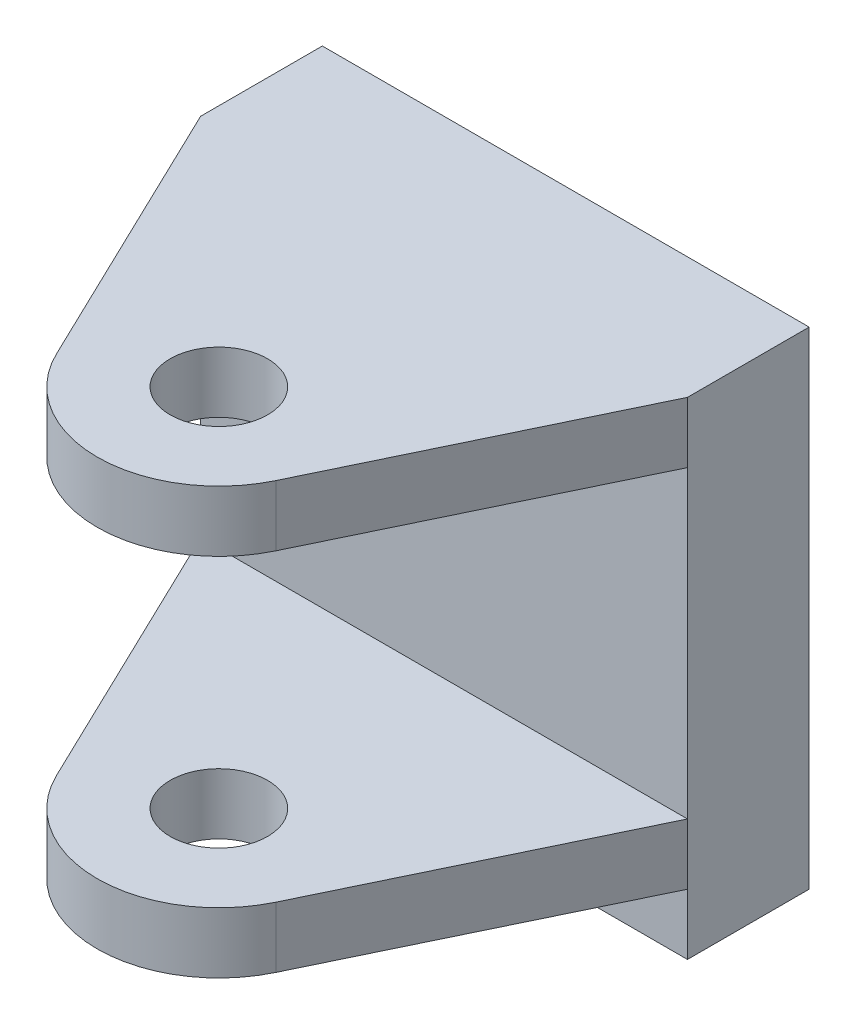
ISO-10303-21;
HEADER;
FILE_DESCRIPTION(('STEP AP214'),'2;1');
FILE_NAME('part.step','',(''),(''),'','','');
FILE_SCHEMA(('AUTOMOTIVE_DESIGN { 1 0 10303 214 1 1 1 1 }'));
ENDSEC;
DATA;
#1=APPLICATION_CONTEXT('core data for automotive mechanical design processes');
#2=APPLICATION_PROTOCOL_DEFINITION('international standard','automotive_design',2000,#1);
#3=PRODUCT_CONTEXT('',#1,'mechanical');
#4=PRODUCT('Part','Part','',(#3));
#5=PRODUCT_RELATED_PRODUCT_CATEGORY('part','',(#4));
#6=PRODUCT_DEFINITION_FORMATION('','',#4);
#7=PRODUCT_DEFINITION_CONTEXT('part definition',#1,'design');
#8=PRODUCT_DEFINITION('design','',#6,#7);
#9=PRODUCT_DEFINITION_SHAPE('','',#8);
#10=(LENGTH_UNIT() NAMED_UNIT(*) SI_UNIT(.MILLI.,.METRE.));
#11=(NAMED_UNIT(*) PLANE_ANGLE_UNIT() SI_UNIT($,.RADIAN.));
#12=(NAMED_UNIT(*) SI_UNIT($,.STERADIAN.) SOLID_ANGLE_UNIT());
#13=UNCERTAINTY_MEASURE_WITH_UNIT(LENGTH_MEASURE(1.E-05),#10,'distance_accuracy_value','');
#14=(GEOMETRIC_REPRESENTATION_CONTEXT(3) GLOBAL_UNCERTAINTY_ASSIGNED_CONTEXT((#13)) GLOBAL_UNIT_ASSIGNED_CONTEXT((#10,
#11,#12)) REPRESENTATION_CONTEXT('',''));
#15=CARTESIAN_POINT('',(0.,0.,0.));
#16=DIRECTION('',(0.,0.,1.));
#17=DIRECTION('',(1.,0.,0.));
#18=AXIS2_PLACEMENT_3D('',#15,#16,#17);
#19=CARTESIAN_POINT('',(0.,0.,10.));
#20=DIRECTION('',(0.,0.,1.));
#21=DIRECTION('',(1.,0.,0.));
#22=AXIS2_PLACEMENT_3D('',#19,#20,#21);
#23=PLANE('',#22);
#24=DIRECTION('',(0.,1.,0.));
#25=VECTOR('',#24,1.);
#26=CARTESIAN_POINT('',(20.,20.,10.));
#27=LINE('',#26,#25);
#28=CARTESIAN_POINT('',(20.,-20.,10.));
#29=VERTEX_POINT('',#28);
#30=CARTESIAN_POINT('',(20.,-15.,10.));
#31=VERTEX_POINT('',#30);
#32=EDGE_CURVE('E183',#29,#31,#27,.T.);
#33=ORIENTED_EDGE('',*,*,#32,.T.);
#34=DIRECTION('',(1.,0.,0.));
#35=VECTOR('',#34,1.);
#36=CARTESIAN_POINT('',(0.,-15.,10.));
#37=LINE('',#36,#35);
#38=CARTESIAN_POINT('',(-20.,-15.,10.));
#39=VERTEX_POINT('',#38);
#40=EDGE_CURVE('E229',#39,#31,#37,.T.);
#41=ORIENTED_EDGE('',*,*,#40,.F.);
#42=DIRECTION('',(0.,-1.,0.));
#43=VECTOR('',#42,1.);
#44=CARTESIAN_POINT('',(-20.,20.,10.));
#45=LINE('',#44,#43);
#46=CARTESIAN_POINT('',(-20.,-20.,10.));
#47=VERTEX_POINT('',#46);
#48=EDGE_CURVE('E186',#39,#47,#45,.T.);
#49=ORIENTED_EDGE('',*,*,#48,.T.);
#50=DIRECTION('',(1.,0.,0.));
#51=VECTOR('',#50,1.);
#52=CARTESIAN_POINT('',(-20.,-20.,10.));
#53=LINE('',#52,#51);
#54=EDGE_CURVE('E191',#47,#29,#53,.T.);
#55=ORIENTED_EDGE('',*,*,#54,.T.);
#56=EDGE_LOOP('',(#33,#41,#49,#55));
#57=FACE_BOUND('',#56,.T.);
#58=ADVANCED_FACE('F37',(#57),#23,.T.);
#59=CARTESIAN_POINT('',(20.,20.,10.));
#60=DIRECTION('',(-1.,0.,0.));
#61=DIRECTION('',(0.,-1.,0.));
#62=AXIS2_PLACEMENT_3D('',#59,#60,#61);
#63=PLANE('',#62);
#64=DIRECTION('',(0.,1.,0.));
#65=VECTOR('',#64,1.);
#66=CARTESIAN_POINT('',(20.,20.,0.));
#67=LINE('',#66,#65);
#68=CARTESIAN_POINT('',(20.,-20.,0.));
#69=VERTEX_POINT('',#68);
#70=CARTESIAN_POINT('',(20.,20.,0.));
#71=VERTEX_POINT('',#70);
#72=EDGE_CURVE('E182',#69,#71,#67,.T.);
#73=ORIENTED_EDGE('',*,*,#72,.T.);
#74=DIRECTION('',(0.,0.,-1.));
#75=VECTOR('',#74,1.);
#76=CARTESIAN_POINT('',(20.,20.,10.));
#77=LINE('',#76,#75);
#78=CARTESIAN_POINT('',(20.,20.,10.));
#79=VERTEX_POINT('',#78);
#80=EDGE_CURVE('E11',#79,#71,#77,.T.);
#81=ORIENTED_EDGE('',*,*,#80,.F.);
#82=DIRECTION('',(0.,-1.,0.));
#83=VECTOR('',#82,1.);
#84=CARTESIAN_POINT('',(20.,20.,10.));
#85=LINE('',#84,#83);
#86=CARTESIAN_POINT('',(20.,15.,10.));
#87=VERTEX_POINT('',#86);
#88=EDGE_CURVE('E165',#79,#87,#85,.T.);
#89=ORIENTED_EDGE('',*,*,#88,.T.);
#90=CARTESIAN_POINT('',(20.,-10.,10.));
#91=VERTEX_POINT('',#90);
#92=EDGE_CURVE('E187',#91,#87,#27,.T.);
#93=ORIENTED_EDGE('',*,*,#92,.F.);
#94=DIRECTION('',(0.,-1.,0.));
#95=VECTOR('',#94,1.);
#96=CARTESIAN_POINT('',(20.,-10.,10.));
#97=LINE('',#96,#95);
#98=EDGE_CURVE('E150',#91,#31,#97,.T.);
#99=ORIENTED_EDGE('',*,*,#98,.T.);
#100=ORIENTED_EDGE('',*,*,#32,.F.);
#101=DIRECTION('',(0.,0.,-1.));
#102=VECTOR('',#101,1.);
#103=CARTESIAN_POINT('',(20.,-20.,10.));
#104=LINE('',#103,#102);
#105=EDGE_CURVE('E194',#29,#69,#104,.T.);
#106=ORIENTED_EDGE('',*,*,#105,.T.);
#107=EDGE_LOOP('',(#73,#81,#89,#93,#99,#100,#106));
#108=FACE_BOUND('',#107,.T.);
#109=ADVANCED_FACE('F39',(#108),#63,.F.);
#110=CARTESIAN_POINT('',(-20.,20.,10.));
#111=DIRECTION('',(0.,-1.,0.));
#112=DIRECTION('',(0.,0.,-1.));
#113=AXIS2_PLACEMENT_3D('',#110,#111,#112);
#114=PLANE('',#113);
#115=DIRECTION('',(-1.,0.,0.));
#116=VECTOR('',#115,1.);
#117=CARTESIAN_POINT('',(-20.,20.,0.));
#118=LINE('',#117,#116);
#119=CARTESIAN_POINT('',(-20.,20.,0.));
#120=VERTEX_POINT('',#119);
#121=EDGE_CURVE('E197',#71,#120,#118,.T.);
#122=ORIENTED_EDGE('',*,*,#121,.T.);
#123=DIRECTION('',(0.,0.,-1.));
#124=VECTOR('',#123,1.);
#125=CARTESIAN_POINT('',(-20.,20.,10.));
#126=LINE('',#125,#124);
#127=CARTESIAN_POINT('',(-20.,20.,10.));
#128=VERTEX_POINT('',#127);
#129=EDGE_CURVE('E45',#128,#120,#126,.T.);
#130=ORIENTED_EDGE('',*,*,#129,.F.);
#131=DIRECTION('',(0.433618101581634,0.,0.901096743963011));
#132=VECTOR('',#131,1.);
#133=CARTESIAN_POINT('',(-20.1468254342011,20.,9.69488376936524));
#134=LINE('',#133,#132);
#135=CARTESIAN_POINT('',(-9.01096743963011,20.,32.8361810158163));
#136=VERTEX_POINT('',#135);
#137=EDGE_CURVE('E154',#128,#136,#134,.T.);
#138=ORIENTED_EDGE('',*,*,#137,.T.);
#139=CARTESIAN_POINT('',(0.,20.,28.5));
#140=DIRECTION('',(0.,1.,0.));
#141=DIRECTION('',(0.,0.,1.));
#142=AXIS2_PLACEMENT_3D('',#139,#140,#141);
#143=CIRCLE('',#142,10.);
#144=CARTESIAN_POINT('',(9.01096743963011,20.,32.8361810158163));
#145=VERTEX_POINT('',#144);
#146=EDGE_CURVE('E157',#136,#145,#143,.T.);
#147=ORIENTED_EDGE('',*,*,#146,.T.);
#148=DIRECTION('',(-0.433618101581633,0.,0.901096743963011));
#149=VECTOR('',#148,1.);
#150=CARTESIAN_POINT('',(20.1468254342011,20.,9.69488376936524));
#151=LINE('',#150,#149);
#152=EDGE_CURVE('E160',#79,#145,#151,.T.);
#153=ORIENTED_EDGE('',*,*,#152,.F.);
#154=ORIENTED_EDGE('',*,*,#80,.T.);
#155=EDGE_LOOP('',(#122,#130,#138,#147,#153,#154));
#156=FACE_BOUND('',#155,.T.);
#157=CARTESIAN_POINT('',(0.,20.,28.5));
#158=DIRECTION('',(0.,1.,0.));
#159=DIRECTION('',(0.,0.,1.));
#160=AXIS2_PLACEMENT_3D('',#157,#158,#159);
#161=CIRCLE('',#160,4.);
#162=CARTESIAN_POINT('',(0.,20.,32.5));
#163=VERTEX_POINT('',#162);
#164=EDGE_CURVE('E163',#163,#163,#161,.T.);
#165=ORIENTED_EDGE('',*,*,#164,.F.);
#166=EDGE_LOOP('',(#165));
#167=FACE_BOUND('',#166,.T.);
#168=ADVANCED_FACE('F245',(#156,#167),#114,.F.);
#169=CARTESIAN_POINT('',(-20.,20.,10.));
#170=DIRECTION('',(1.,0.,0.));
#171=DIRECTION('',(0.,0.,-1.));
#172=AXIS2_PLACEMENT_3D('',#169,#170,#171);
#173=PLANE('',#172);
#174=DIRECTION('',(0.,-1.,0.));
#175=VECTOR('',#174,1.);
#176=CARTESIAN_POINT('',(-20.,20.,0.));
#177=LINE('',#176,#175);
#178=CARTESIAN_POINT('',(-20.,-20.,0.));
#179=VERTEX_POINT('',#178);
#180=EDGE_CURVE('E199',#120,#179,#177,.T.);
#181=ORIENTED_EDGE('',*,*,#180,.T.);
#182=DIRECTION('',(0.,0.,-1.));
#183=VECTOR('',#182,1.);
#184=CARTESIAN_POINT('',(-20.,-20.,10.));
#185=LINE('',#184,#183);
#186=EDGE_CURVE('E205',#47,#179,#185,.T.);
#187=ORIENTED_EDGE('',*,*,#186,.F.);
#188=ORIENTED_EDGE('',*,*,#48,.F.);
#189=DIRECTION('',(0.,-1.,0.));
#190=VECTOR('',#189,1.);
#191=CARTESIAN_POINT('',(-20.,-10.,10.));
#192=LINE('',#191,#190);
#193=CARTESIAN_POINT('',(-20.,-10.,10.));
#194=VERTEX_POINT('',#193);
#195=EDGE_CURVE('E232',#194,#39,#192,.T.);
#196=ORIENTED_EDGE('',*,*,#195,.F.);
#197=CARTESIAN_POINT('',(-20.,15.,10.));
#198=VERTEX_POINT('',#197);
#199=EDGE_CURVE('E192',#198,#194,#45,.T.);
#200=ORIENTED_EDGE('',*,*,#199,.F.);
#201=EDGE_CURVE('E188',#128,#198,#45,.T.);
#202=ORIENTED_EDGE('',*,*,#201,.F.);
#203=ORIENTED_EDGE('',*,*,#129,.T.);
#204=EDGE_LOOP('',(#181,#187,#188,#196,#200,#202,#203));
#205=FACE_BOUND('',#204,.T.);
#206=ADVANCED_FACE('F211',(#205),#173,.F.);
#207=CARTESIAN_POINT('',(-20.,-20.,10.));
#208=DIRECTION('',(0.,1.,0.));
#209=DIRECTION('',(0.,0.,1.));
#210=AXIS2_PLACEMENT_3D('',#207,#208,#209);
#211=PLANE('',#210);
#212=DIRECTION('',(1.,0.,0.));
#213=VECTOR('',#212,1.);
#214=CARTESIAN_POINT('',(-20.,-20.,0.));
#215=LINE('',#214,#213);
#216=EDGE_CURVE('E201',#179,#69,#215,.T.);
#217=ORIENTED_EDGE('',*,*,#216,.T.);
#218=ORIENTED_EDGE('',*,*,#105,.F.);
#219=ORIENTED_EDGE('',*,*,#54,.F.);
#220=ORIENTED_EDGE('',*,*,#186,.T.);
#221=EDGE_LOOP('',(#217,#218,#219,#220));
#222=FACE_BOUND('',#221,.T.);
#223=ADVANCED_FACE('F221',(#222),#211,.F.);
#224=DIRECTION('',(1.,0.,0.));
#225=VECTOR('',#224,1.);
#226=CARTESIAN_POINT('',(0.,-10.,10.));
#227=LINE('',#226,#225);
#228=EDGE_CURVE('E139',#194,#91,#227,.T.);
#229=ORIENTED_EDGE('',*,*,#228,.T.);
#230=ORIENTED_EDGE('',*,*,#92,.T.);
#231=DIRECTION('',(1.,0.,0.));
#232=VECTOR('',#231,1.);
#233=CARTESIAN_POINT('',(0.,15.,10.));
#234=LINE('',#233,#232);
#235=EDGE_CURVE('E60',#198,#87,#234,.T.);
#236=ORIENTED_EDGE('',*,*,#235,.F.);
#237=ORIENTED_EDGE('',*,*,#199,.T.);
#238=EDGE_LOOP('',(#229,#230,#236,#237));
#239=FACE_BOUND('',#238,.T.);
#240=ADVANCED_FACE('F231',(#239),#23,.T.);
#241=CARTESIAN_POINT('',(0.,0.,0.));
#242=DIRECTION('',(0.,0.,1.));
#243=DIRECTION('',(1.,0.,0.));
#244=AXIS2_PLACEMENT_3D('',#241,#242,#243);
#245=PLANE('',#244);
#246=ORIENTED_EDGE('',*,*,#72,.F.);
#247=ORIENTED_EDGE('',*,*,#216,.F.);
#248=ORIENTED_EDGE('',*,*,#180,.F.);
#249=ORIENTED_EDGE('',*,*,#121,.F.);
#250=EDGE_LOOP('',(#246,#247,#248,#249));
#251=FACE_BOUND('',#250,.T.);
#252=ADVANCED_FACE('F218',(#251),#245,.F.);
#253=CARTESIAN_POINT('',(-20.1468254342011,20.,9.69488376936524));
#254=DIRECTION('',(0.901096743963011,0.,-0.433618101581634));
#255=DIRECTION('',(-0.433618101581634,0.,-0.901096743963011));
#256=AXIS2_PLACEMENT_3D('',#253,#254,#255);
#257=PLANE('',#256);
#258=DIRECTION('',(0.433618101581634,0.,0.901096743963011));
#259=VECTOR('',#258,1.);
#260=CARTESIAN_POINT('',(-20.1468254342011,15.,9.69488376936524));
#261=LINE('',#260,#259);
#262=CARTESIAN_POINT('',(-9.01096743963011,15.,32.8361810158163));
#263=VERTEX_POINT('',#262);
#264=EDGE_CURVE('E145',#198,#263,#261,.T.);
#265=ORIENTED_EDGE('',*,*,#264,.T.);
#266=DIRECTION('',(0.,-1.,0.));
#267=VECTOR('',#266,1.);
#268=CARTESIAN_POINT('',(-9.01096743963011,20.,32.8361810158163));
#269=LINE('',#268,#267);
#270=EDGE_CURVE('E179',#136,#263,#269,.T.);
#271=ORIENTED_EDGE('',*,*,#270,.F.);
#272=ORIENTED_EDGE('',*,*,#137,.F.);
#273=ORIENTED_EDGE('',*,*,#201,.T.);
#274=EDGE_LOOP('',(#265,#271,#272,#273));
#275=FACE_BOUND('',#274,.T.);
#276=ADVANCED_FACE('F235',(#275),#257,.F.);
#277=CARTESIAN_POINT('',(0.,20.,28.5));
#278=DIRECTION('',(0.,-1.,0.));
#279=DIRECTION('',(0.,0.,-1.));
#280=AXIS2_PLACEMENT_3D('',#277,#278,#279);
#281=CYLINDRICAL_SURFACE('',#280,10.);
#282=CARTESIAN_POINT('',(0.,15.,28.5));
#283=DIRECTION('',(0.,1.,0.));
#284=DIRECTION('',(0.,0.,1.));
#285=AXIS2_PLACEMENT_3D('',#282,#283,#284);
#286=CIRCLE('',#285,10.);
#287=CARTESIAN_POINT('',(9.01096743963011,15.,32.8361810158163));
#288=VERTEX_POINT('',#287);
#289=EDGE_CURVE('E148',#263,#288,#286,.T.);
#290=ORIENTED_EDGE('',*,*,#289,.T.);
#291=DIRECTION('',(0.,-1.,0.));
#292=VECTOR('',#291,1.);
#293=CARTESIAN_POINT('',(9.01096743963011,20.,32.8361810158163));
#294=LINE('',#293,#292);
#295=EDGE_CURVE('E177',#145,#288,#294,.T.);
#296=ORIENTED_EDGE('',*,*,#295,.F.);
#297=ORIENTED_EDGE('',*,*,#146,.F.);
#298=ORIENTED_EDGE('',*,*,#270,.T.);
#299=EDGE_LOOP('',(#290,#296,#297,#298));
#300=FACE_BOUND('',#299,.T.);
#301=ADVANCED_FACE('F243',(#300),#281,.T.);
#302=CARTESIAN_POINT('',(20.1468254342011,20.,9.69488376936524));
#303=DIRECTION('',(0.901096743963011,0.,0.433618101581633));
#304=DIRECTION('',(0.433618101581633,0.,-0.901096743963011));
#305=AXIS2_PLACEMENT_3D('',#302,#303,#304);
#306=PLANE('',#305);
#307=DIRECTION('',(-0.433618101581633,0.,0.901096743963011));
#308=VECTOR('',#307,1.);
#309=CARTESIAN_POINT('',(20.1468254342011,15.,9.69488376936524));
#310=LINE('',#309,#308);
#311=EDGE_CURVE('E169',#87,#288,#310,.T.);
#312=ORIENTED_EDGE('',*,*,#311,.F.);
#313=ORIENTED_EDGE('',*,*,#88,.F.);
#314=ORIENTED_EDGE('',*,*,#152,.T.);
#315=ORIENTED_EDGE('',*,*,#295,.T.);
#316=EDGE_LOOP('',(#312,#313,#314,#315));
#317=FACE_BOUND('',#316,.T.);
#318=ADVANCED_FACE('F253',(#317),#306,.T.);
#319=CARTESIAN_POINT('',(0.,20.,28.5));
#320=DIRECTION('',(0.,-1.,0.));
#321=DIRECTION('',(0.,0.,-1.));
#322=AXIS2_PLACEMENT_3D('',#319,#320,#321);
#323=CYLINDRICAL_SURFACE('',#322,4.);
#324=ORIENTED_EDGE('',*,*,#164,.T.);
#325=EDGE_LOOP('',(#324));
#326=FACE_BOUND('',#325,.T.);
#327=CARTESIAN_POINT('',(0.,15.,28.5));
#328=DIRECTION('',(0.,1.,0.));
#329=DIRECTION('',(0.,0.,1.));
#330=AXIS2_PLACEMENT_3D('',#327,#328,#329);
#331=CIRCLE('',#330,4.);
#332=CARTESIAN_POINT('',(0.,15.,32.5));
#333=VERTEX_POINT('',#332);
#334=EDGE_CURVE('E158',#333,#333,#331,.T.);
#335=ORIENTED_EDGE('',*,*,#334,.F.);
#336=EDGE_LOOP('',(#335));
#337=FACE_BOUND('',#336,.T.);
#338=ADVANCED_FACE('F250',(#326,#337),#323,.F.);
#339=CARTESIAN_POINT('',(0.,15.,0.));
#340=DIRECTION('',(0.,1.,0.));
#341=DIRECTION('',(0.,0.,1.));
#342=AXIS2_PLACEMENT_3D('',#339,#340,#341);
#343=PLANE('',#342);
#344=ORIENTED_EDGE('',*,*,#264,.F.);
#345=ORIENTED_EDGE('',*,*,#235,.T.);
#346=ORIENTED_EDGE('',*,*,#311,.T.);
#347=ORIENTED_EDGE('',*,*,#289,.F.);
#348=EDGE_LOOP('',(#344,#345,#346,#347));
#349=FACE_BOUND('',#348,.T.);
#350=ORIENTED_EDGE('',*,*,#334,.T.);
#351=EDGE_LOOP('',(#350));
#352=FACE_BOUND('',#351,.T.);
#353=ADVANCED_FACE('F238',(#349,#352),#343,.F.);
#354=CARTESIAN_POINT('',(-20.1468254342011,-10.,9.69488376936524));
#355=DIRECTION('',(0.901096743963011,0.,-0.433618101581634));
#356=DIRECTION('',(-0.433618101581634,0.,-0.901096743963011));
#357=AXIS2_PLACEMENT_3D('',#354,#355,#356);
#358=PLANE('',#357);
#359=DIRECTION('',(0.433618101581634,0.,0.901096743963011));
#360=VECTOR('',#359,1.);
#361=CARTESIAN_POINT('',(-20.1468254342011,-15.,9.69488376936524));
#362=LINE('',#361,#360);
#363=CARTESIAN_POINT('',(-9.01096743963011,-15.,32.8361810158163));
#364=VERTEX_POINT('',#363);
#365=EDGE_CURVE('E52',#39,#364,#362,.T.);
#366=ORIENTED_EDGE('',*,*,#365,.T.);
#367=DIRECTION('',(0.,-1.,0.));
#368=VECTOR('',#367,1.);
#369=CARTESIAN_POINT('',(-9.01096743963011,-10.,32.8361810158163));
#370=LINE('',#369,#368);
#371=CARTESIAN_POINT('',(-9.01096743963011,-10.,32.8361810158163));
#372=VERTEX_POINT('',#371);
#373=EDGE_CURVE('E127',#372,#364,#370,.T.);
#374=ORIENTED_EDGE('',*,*,#373,.F.);
#375=DIRECTION('',(0.433618101581634,0.,0.901096743963011));
#376=VECTOR('',#375,1.);
#377=CARTESIAN_POINT('',(-20.1468254342011,-10.,9.69488376936524));
#378=LINE('',#377,#376);
#379=EDGE_CURVE('E133',#194,#372,#378,.T.);
#380=ORIENTED_EDGE('',*,*,#379,.F.);
#381=ORIENTED_EDGE('',*,*,#195,.T.);
#382=EDGE_LOOP('',(#366,#374,#380,#381));
#383=FACE_BOUND('',#382,.T.);
#384=ADVANCED_FACE('F144',(#383),#358,.F.);
#385=CARTESIAN_POINT('',(0.,-10.,28.5));
#386=DIRECTION('',(0.,-1.,0.));
#387=DIRECTION('',(0.,0.,-1.));
#388=AXIS2_PLACEMENT_3D('',#385,#386,#387);
#389=CYLINDRICAL_SURFACE('',#388,10.);
#390=CARTESIAN_POINT('',(0.,-15.,28.5));
#391=DIRECTION('',(0.,1.,0.));
#392=DIRECTION('',(0.,0.,1.));
#393=AXIS2_PLACEMENT_3D('',#390,#391,#392);
#394=CIRCLE('',#393,10.);
#395=CARTESIAN_POINT('',(9.01096743963011,-15.,32.8361810158163));
#396=VERTEX_POINT('',#395);
#397=EDGE_CURVE('E422',#364,#396,#394,.T.);
#398=ORIENTED_EDGE('',*,*,#397,.T.);
#399=DIRECTION('',(0.,-1.,0.));
#400=VECTOR('',#399,1.);
#401=CARTESIAN_POINT('',(9.01096743963011,-10.,32.8361810158163));
#402=LINE('',#401,#400);
#403=CARTESIAN_POINT('',(9.01096743963011,-10.,32.8361810158163));
#404=VERTEX_POINT('',#403);
#405=EDGE_CURVE('E128',#404,#396,#402,.T.);
#406=ORIENTED_EDGE('',*,*,#405,.F.);
#407=CARTESIAN_POINT('',(0.,-10.,28.5));
#408=DIRECTION('',(0.,1.,0.));
#409=DIRECTION('',(0.,0.,1.));
#410=AXIS2_PLACEMENT_3D('',#407,#408,#409);
#411=CIRCLE('',#410,10.);
#412=EDGE_CURVE('E122',#372,#404,#411,.T.);
#413=ORIENTED_EDGE('',*,*,#412,.F.);
#414=ORIENTED_EDGE('',*,*,#373,.T.);
#415=EDGE_LOOP('',(#398,#406,#413,#414));
#416=FACE_BOUND('',#415,.T.);
#417=ADVANCED_FACE('F125',(#416),#389,.T.);
#418=CARTESIAN_POINT('',(20.1468254342011,-10.,9.69488376936524));
#419=DIRECTION('',(0.901096743963011,0.,0.433618101581633));
#420=DIRECTION('',(0.433618101581633,0.,-0.901096743963011));
#421=AXIS2_PLACEMENT_3D('',#418,#419,#420);
#422=PLANE('',#421);
#423=DIRECTION('',(-0.433618101581633,0.,0.901096743963011));
#424=VECTOR('',#423,1.);
#425=CARTESIAN_POINT('',(20.1468254342011,-15.,9.69488376936524));
#426=LINE('',#425,#424);
#427=EDGE_CURVE('E410',#31,#396,#426,.T.);
#428=ORIENTED_EDGE('',*,*,#427,.F.);
#429=ORIENTED_EDGE('',*,*,#98,.F.);
#430=DIRECTION('',(-0.433618101581633,0.,0.901096743963011));
#431=VECTOR('',#430,1.);
#432=CARTESIAN_POINT('',(20.1468254342011,-10.,9.69488376936524));
#433=LINE('',#432,#431);
#434=EDGE_CURVE('E132',#91,#404,#433,.T.);
#435=ORIENTED_EDGE('',*,*,#434,.T.);
#436=ORIENTED_EDGE('',*,*,#405,.T.);
#437=EDGE_LOOP('',(#428,#429,#435,#436));
#438=FACE_BOUND('',#437,.T.);
#439=ADVANCED_FACE('F361',(#438),#422,.T.);
#440=CARTESIAN_POINT('',(0.,-10.,28.5));
#441=DIRECTION('',(0.,-1.,0.));
#442=DIRECTION('',(0.,0.,-1.));
#443=AXIS2_PLACEMENT_3D('',#440,#441,#442);
#444=CYLINDRICAL_SURFACE('',#443,4.);
#445=CARTESIAN_POINT('',(0.,-10.,28.5));
#446=DIRECTION('',(0.,1.,0.));
#447=DIRECTION('',(0.,0.,1.));
#448=AXIS2_PLACEMENT_3D('',#445,#446,#447);
#449=CIRCLE('',#448,4.);
#450=CARTESIAN_POINT('',(0.,-10.,32.5));
#451=VERTEX_POINT('',#450);
#452=EDGE_CURVE('E414',#451,#451,#449,.T.);
#453=ORIENTED_EDGE('',*,*,#452,.T.);
#454=EDGE_LOOP('',(#453));
#455=FACE_BOUND('',#454,.T.);
#456=CARTESIAN_POINT('',(0.,-15.,28.5));
#457=DIRECTION('',(0.,1.,0.));
#458=DIRECTION('',(0.,0.,1.));
#459=AXIS2_PLACEMENT_3D('',#456,#457,#458);
#460=CIRCLE('',#459,4.);
#461=CARTESIAN_POINT('',(0.,-15.,32.5));
#462=VERTEX_POINT('',#461);
#463=EDGE_CURVE('E142',#462,#462,#460,.T.);
#464=ORIENTED_EDGE('',*,*,#463,.F.);
#465=EDGE_LOOP('',(#464));
#466=FACE_BOUND('',#465,.T.);
#467=ADVANCED_FACE('F370',(#455,#466),#444,.F.);
#468=CARTESIAN_POINT('',(0.,-10.,0.));
#469=DIRECTION('',(0.,1.,0.));
#470=DIRECTION('',(0.,0.,1.));
#471=AXIS2_PLACEMENT_3D('',#468,#469,#470);
#472=PLANE('',#471);
#473=ORIENTED_EDGE('',*,*,#379,.T.);
#474=ORIENTED_EDGE('',*,*,#412,.T.);
#475=ORIENTED_EDGE('',*,*,#434,.F.);
#476=ORIENTED_EDGE('',*,*,#228,.F.);
#477=EDGE_LOOP('',(#473,#474,#475,#476));
#478=FACE_BOUND('',#477,.T.);
#479=ORIENTED_EDGE('',*,*,#452,.F.);
#480=EDGE_LOOP('',(#479));
#481=FACE_BOUND('',#480,.T.);
#482=ADVANCED_FACE('F136',(#478,#481),#472,.T.);
#483=CARTESIAN_POINT('',(0.,-15.,0.));
#484=DIRECTION('',(0.,1.,0.));
#485=DIRECTION('',(0.,0.,1.));
#486=AXIS2_PLACEMENT_3D('',#483,#484,#485);
#487=PLANE('',#486);
#488=ORIENTED_EDGE('',*,*,#365,.F.);
#489=ORIENTED_EDGE('',*,*,#40,.T.);
#490=ORIENTED_EDGE('',*,*,#427,.T.);
#491=ORIENTED_EDGE('',*,*,#397,.F.);
#492=EDGE_LOOP('',(#488,#489,#490,#491));
#493=FACE_BOUND('',#492,.T.);
#494=ORIENTED_EDGE('',*,*,#463,.T.);
#495=EDGE_LOOP('',(#494));
#496=FACE_BOUND('',#495,.T.);
#497=ADVANCED_FACE('F390',(#493,#496),#487,.F.);
#498=CLOSED_SHELL('',(#58,#109,#168,#206,#223,#240,#252,#276,#301,#318,#338,#353,#384,#417,#439,
#467,#482,#497));
#499=MANIFOLD_SOLID_BREP('B2',#498);
#500=ADVANCED_BREP_SHAPE_REPRESENTATION('',(#18,#499),#14);
#501=SHAPE_DEFINITION_REPRESENTATION(#9,#500);
ENDSEC;
END-ISO-10303-21;
